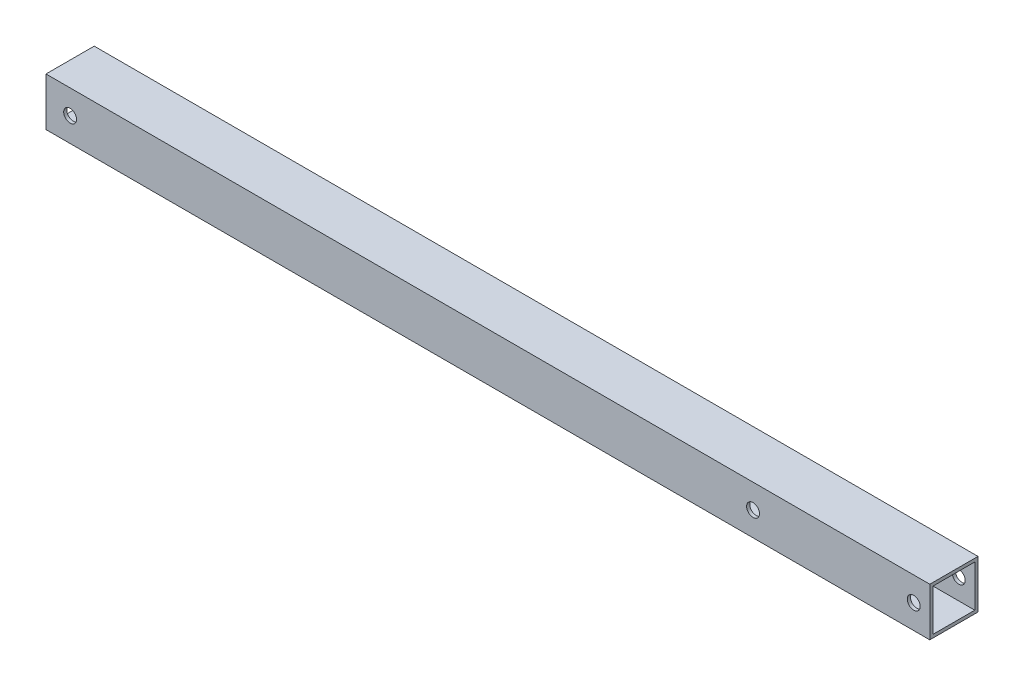
ISO-10303-21;
HEADER;
FILE_DESCRIPTION(('STEP AP214'),'2;1');
FILE_NAME('part.step','',(''),(''),'','','');
FILE_SCHEMA(('AUTOMOTIVE_DESIGN { 1 0 10303 214 1 1 1 1 }'));
ENDSEC;
DATA;
#1=APPLICATION_CONTEXT('core data for automotive mechanical design processes');
#2=APPLICATION_PROTOCOL_DEFINITION('international standard','automotive_design',2000,#1);
#3=PRODUCT_CONTEXT('',#1,'mechanical');
#4=PRODUCT('Part','Part','',(#3));
#5=PRODUCT_RELATED_PRODUCT_CATEGORY('part','',(#4));
#6=PRODUCT_DEFINITION_FORMATION('','',#4);
#7=PRODUCT_DEFINITION_CONTEXT('part definition',#1,'design');
#8=PRODUCT_DEFINITION('design','',#6,#7);
#9=PRODUCT_DEFINITION_SHAPE('','',#8);
#10=(LENGTH_UNIT() NAMED_UNIT(*) SI_UNIT(.MILLI.,.METRE.));
#11=(NAMED_UNIT(*) PLANE_ANGLE_UNIT() SI_UNIT($,.RADIAN.));
#12=(NAMED_UNIT(*) SI_UNIT($,.STERADIAN.) SOLID_ANGLE_UNIT());
#13=UNCERTAINTY_MEASURE_WITH_UNIT(LENGTH_MEASURE(1.E-05),#10,'distance_accuracy_value','');
#14=(GEOMETRIC_REPRESENTATION_CONTEXT(3) GLOBAL_UNCERTAINTY_ASSIGNED_CONTEXT((#13)) GLOBAL_UNIT_ASSIGNED_CONTEXT((#10,
#11,#12)) REPRESENTATION_CONTEXT('',''));
#15=CARTESIAN_POINT('',(0.,0.,0.));
#16=DIRECTION('',(0.,0.,1.));
#17=DIRECTION('',(1.,0.,0.));
#18=AXIS2_PLACEMENT_3D('',#15,#16,#17);
#19=CARTESIAN_POINT('',(550.,0.,0.));
#20=DIRECTION('',(-1.,0.,0.));
#21=DIRECTION('',(0.,0.,1.));
#22=AXIS2_PLACEMENT_3D('',#19,#20,#21);
#23=PLANE('',#22);
#24=DIRECTION('',(0.,-1.,0.));
#25=VECTOR('',#24,1.);
#26=CARTESIAN_POINT('',(550.,0.,0.));
#27=LINE('',#26,#25);
#28=CARTESIAN_POINT('',(550.,30.,0.));
#29=VERTEX_POINT('',#28);
#30=CARTESIAN_POINT('',(550.,0.,0.));
#31=VERTEX_POINT('',#30);
#32=EDGE_CURVE('E138',#29,#31,#27,.T.);
#33=ORIENTED_EDGE('',*,*,#32,.T.);
#34=DIRECTION('',(0.,0.,-1.));
#35=VECTOR('',#34,1.);
#36=CARTESIAN_POINT('',(550.,0.,0.));
#37=LINE('',#36,#35);
#38=CARTESIAN_POINT('',(550.,0.,-30.));
#39=VERTEX_POINT('',#38);
#40=EDGE_CURVE('E141',#31,#39,#37,.T.);
#41=ORIENTED_EDGE('',*,*,#40,.T.);
#42=DIRECTION('',(0.,1.,0.));
#43=VECTOR('',#42,1.);
#44=CARTESIAN_POINT('',(550.,0.,-30.));
#45=LINE('',#44,#43);
#46=CARTESIAN_POINT('',(550.,30.,-30.));
#47=VERTEX_POINT('',#46);
#48=EDGE_CURVE('E144',#39,#47,#45,.T.);
#49=ORIENTED_EDGE('',*,*,#48,.T.);
#50=DIRECTION('',(0.,0.,1.));
#51=VECTOR('',#50,1.);
#52=CARTESIAN_POINT('',(550.,30.,0.));
#53=LINE('',#52,#51);
#54=EDGE_CURVE('E146',#47,#29,#53,.T.);
#55=ORIENTED_EDGE('',*,*,#54,.T.);
#56=EDGE_LOOP('',(#33,#41,#49,#55));
#57=FACE_BOUND('',#56,.T.);
#58=DIRECTION('',(0.,-1.,0.));
#59=VECTOR('',#58,1.);
#60=CARTESIAN_POINT('',(550.,2.,-2.));
#61=LINE('',#60,#59);
#62=CARTESIAN_POINT('',(550.,28.,-2.));
#63=VERTEX_POINT('',#62);
#64=CARTESIAN_POINT('',(550.,2.,-2.));
#65=VERTEX_POINT('',#64);
#66=EDGE_CURVE('E100',#63,#65,#61,.T.);
#67=ORIENTED_EDGE('',*,*,#66,.F.);
#68=DIRECTION('',(0.,0.,1.));
#69=VECTOR('',#68,1.);
#70=CARTESIAN_POINT('',(550.,28.,-2.));
#71=LINE('',#70,#69);
#72=CARTESIAN_POINT('',(550.,28.,-28.));
#73=VERTEX_POINT('',#72);
#74=EDGE_CURVE('E122',#73,#63,#71,.T.);
#75=ORIENTED_EDGE('',*,*,#74,.F.);
#76=DIRECTION('',(0.,1.,0.));
#77=VECTOR('',#76,1.);
#78=CARTESIAN_POINT('',(550.,2.,-28.));
#79=LINE('',#78,#77);
#80=CARTESIAN_POINT('',(550.,2.,-28.));
#81=VERTEX_POINT('',#80);
#82=EDGE_CURVE('E120',#81,#73,#79,.T.);
#83=ORIENTED_EDGE('',*,*,#82,.F.);
#84=DIRECTION('',(0.,0.,-1.));
#85=VECTOR('',#84,1.);
#86=CARTESIAN_POINT('',(550.,2.,-2.));
#87=LINE('',#86,#85);
#88=EDGE_CURVE('E108',#65,#81,#87,.T.);
#89=ORIENTED_EDGE('',*,*,#88,.F.);
#90=EDGE_LOOP('',(#67,#75,#83,#89));
#91=FACE_BOUND('',#90,.T.);
#92=ADVANCED_FACE('F33',(#57,#91),#23,.F.);
#93=CARTESIAN_POINT('',(0.,0.,0.));
#94=DIRECTION('',(-1.,0.,0.));
#95=DIRECTION('',(0.,0.,1.));
#96=AXIS2_PLACEMENT_3D('',#93,#94,#95);
#97=PLANE('',#96);
#98=DIRECTION('',(0.,-1.,0.));
#99=VECTOR('',#98,1.);
#100=CARTESIAN_POINT('',(0.,0.,0.));
#101=LINE('',#100,#99);
#102=CARTESIAN_POINT('',(0.,30.,0.));
#103=VERTEX_POINT('',#102);
#104=CARTESIAN_POINT('',(0.,0.,0.));
#105=VERTEX_POINT('',#104);
#106=EDGE_CURVE('E116',#103,#105,#101,.T.);
#107=ORIENTED_EDGE('',*,*,#106,.F.);
#108=DIRECTION('',(0.,0.,1.));
#109=VECTOR('',#108,1.);
#110=CARTESIAN_POINT('',(0.,30.,0.));
#111=LINE('',#110,#109);
#112=CARTESIAN_POINT('',(0.,30.,-30.));
#113=VERTEX_POINT('',#112);
#114=EDGE_CURVE('E142',#113,#103,#111,.T.);
#115=ORIENTED_EDGE('',*,*,#114,.F.);
#116=DIRECTION('',(0.,1.,0.));
#117=VECTOR('',#116,1.);
#118=CARTESIAN_POINT('',(0.,0.,-30.));
#119=LINE('',#118,#117);
#120=CARTESIAN_POINT('',(0.,0.,-30.));
#121=VERTEX_POINT('',#120);
#122=EDGE_CURVE('E153',#121,#113,#119,.T.);
#123=ORIENTED_EDGE('',*,*,#122,.F.);
#124=DIRECTION('',(0.,0.,-1.));
#125=VECTOR('',#124,1.);
#126=CARTESIAN_POINT('',(0.,0.,0.));
#127=LINE('',#126,#125);
#128=EDGE_CURVE('E151',#105,#121,#127,.T.);
#129=ORIENTED_EDGE('',*,*,#128,.F.);
#130=EDGE_LOOP('',(#107,#115,#123,#129));
#131=FACE_BOUND('',#130,.T.);
#132=DIRECTION('',(0.,0.,1.));
#133=VECTOR('',#132,1.);
#134=CARTESIAN_POINT('',(0.,28.,-2.));
#135=LINE('',#134,#133);
#136=CARTESIAN_POINT('',(0.,28.,-28.));
#137=VERTEX_POINT('',#136);
#138=CARTESIAN_POINT('',(0.,28.,-2.));
#139=VERTEX_POINT('',#138);
#140=EDGE_CURVE('E109',#137,#139,#135,.T.);
#141=ORIENTED_EDGE('',*,*,#140,.T.);
#142=DIRECTION('',(0.,-1.,0.));
#143=VECTOR('',#142,1.);
#144=CARTESIAN_POINT('',(0.,2.,-2.));
#145=LINE('',#144,#143);
#146=CARTESIAN_POINT('',(0.,2.,-2.));
#147=VERTEX_POINT('',#146);
#148=EDGE_CURVE('E58',#139,#147,#145,.T.);
#149=ORIENTED_EDGE('',*,*,#148,.T.);
#150=DIRECTION('',(0.,0.,-1.));
#151=VECTOR('',#150,1.);
#152=CARTESIAN_POINT('',(0.,2.,-2.));
#153=LINE('',#152,#151);
#154=CARTESIAN_POINT('',(0.,2.,-28.));
#155=VERTEX_POINT('',#154);
#156=EDGE_CURVE('E115',#147,#155,#153,.T.);
#157=ORIENTED_EDGE('',*,*,#156,.T.);
#158=DIRECTION('',(0.,1.,0.));
#159=VECTOR('',#158,1.);
#160=CARTESIAN_POINT('',(0.,2.,-28.));
#161=LINE('',#160,#159);
#162=EDGE_CURVE('E130',#155,#137,#161,.T.);
#163=ORIENTED_EDGE('',*,*,#162,.T.);
#164=EDGE_LOOP('',(#141,#149,#157,#163));
#165=FACE_BOUND('',#164,.T.);
#166=ADVANCED_FACE('F209',(#131,#165),#97,.T.);
#167=CARTESIAN_POINT('',(550.,0.,0.));
#168=DIRECTION('',(0.,0.,-1.));
#169=DIRECTION('',(-1.,0.,0.));
#170=AXIS2_PLACEMENT_3D('',#167,#168,#169);
#171=PLANE('',#170);
#172=CARTESIAN_POINT('',(15.,15.,0.));
#173=DIRECTION('',(0.,0.,-1.));
#174=DIRECTION('',(-1.,0.,0.));
#175=AXIS2_PLACEMENT_3D('',#172,#173,#174);
#176=CIRCLE('',#175,4.);
#177=CARTESIAN_POINT('',(19.,15.,0.));
#178=VERTEX_POINT('',#177);
#179=EDGE_CURVE('E128',#178,#178,#176,.T.);
#180=ORIENTED_EDGE('',*,*,#179,.T.);
#181=EDGE_LOOP('',(#180));
#182=FACE_BOUND('',#181,.T.);
#183=CARTESIAN_POINT('',(540.,15.,0.));
#184=DIRECTION('',(0.,0.,-1.));
#185=DIRECTION('',(-1.,0.,0.));
#186=AXIS2_PLACEMENT_3D('',#183,#184,#185);
#187=CIRCLE('',#186,3.99999999999999);
#188=CARTESIAN_POINT('',(544.,15.,0.));
#189=VERTEX_POINT('',#188);
#190=EDGE_CURVE('E174',#189,#189,#187,.T.);
#191=ORIENTED_EDGE('',*,*,#190,.T.);
#192=EDGE_LOOP('',(#191));
#193=FACE_BOUND('',#192,.T.);
#194=CARTESIAN_POINT('',(440.,15.,0.));
#195=DIRECTION('',(0.,0.,-1.));
#196=DIRECTION('',(-1.,0.,0.));
#197=AXIS2_PLACEMENT_3D('',#194,#195,#196);
#198=CIRCLE('',#197,3.99999999999982);
#199=CARTESIAN_POINT('',(444.,15.,0.));
#200=VERTEX_POINT('',#199);
#201=EDGE_CURVE('E170',#200,#200,#198,.T.);
#202=ORIENTED_EDGE('',*,*,#201,.T.);
#203=EDGE_LOOP('',(#202));
#204=FACE_BOUND('',#203,.T.);
#205=ORIENTED_EDGE('',*,*,#106,.T.);
#206=DIRECTION('',(-1.,0.,0.));
#207=VECTOR('',#206,1.);
#208=CARTESIAN_POINT('',(550.,0.,0.));
#209=LINE('',#208,#207);
#210=EDGE_CURVE('E11',#31,#105,#209,.T.);
#211=ORIENTED_EDGE('',*,*,#210,.F.);
#212=ORIENTED_EDGE('',*,*,#32,.F.);
#213=DIRECTION('',(-1.,0.,0.));
#214=VECTOR('',#213,1.);
#215=CARTESIAN_POINT('',(550.,30.,0.));
#216=LINE('',#215,#214);
#217=EDGE_CURVE('E148',#29,#103,#216,.T.);
#218=ORIENTED_EDGE('',*,*,#217,.T.);
#219=EDGE_LOOP('',(#205,#211,#212,#218));
#220=FACE_BOUND('',#219,.T.);
#221=ADVANCED_FACE('F35',(#182,#193,#204,#220),#171,.F.);
#222=CARTESIAN_POINT('',(550.,0.,0.));
#223=DIRECTION('',(0.,1.,0.));
#224=DIRECTION('',(0.,0.,1.));
#225=AXIS2_PLACEMENT_3D('',#222,#223,#224);
#226=PLANE('',#225);
#227=ORIENTED_EDGE('',*,*,#128,.T.);
#228=DIRECTION('',(-1.,0.,0.));
#229=VECTOR('',#228,1.);
#230=CARTESIAN_POINT('',(550.,0.,-30.));
#231=LINE('',#230,#229);
#232=EDGE_CURVE('E42',#39,#121,#231,.T.);
#233=ORIENTED_EDGE('',*,*,#232,.F.);
#234=ORIENTED_EDGE('',*,*,#40,.F.);
#235=ORIENTED_EDGE('',*,*,#210,.T.);
#236=EDGE_LOOP('',(#227,#233,#234,#235));
#237=FACE_BOUND('',#236,.T.);
#238=ADVANCED_FACE('F226',(#237),#226,.F.);
#239=CARTESIAN_POINT('',(550.,0.,-30.));
#240=DIRECTION('',(0.,0.,1.));
#241=DIRECTION('',(1.,0.,0.));
#242=AXIS2_PLACEMENT_3D('',#239,#240,#241);
#243=PLANE('',#242);
#244=CARTESIAN_POINT('',(15.,15.,-30.));
#245=DIRECTION('',(0.,0.,1.));
#246=DIRECTION('',(1.,0.,0.));
#247=AXIS2_PLACEMENT_3D('',#244,#245,#246);
#248=CIRCLE('',#247,4.);
#249=CARTESIAN_POINT('',(19.,15.,-30.));
#250=VERTEX_POINT('',#249);
#251=EDGE_CURVE('E166',#250,#250,#248,.T.);
#252=ORIENTED_EDGE('',*,*,#251,.T.);
#253=EDGE_LOOP('',(#252));
#254=FACE_BOUND('',#253,.T.);
#255=CARTESIAN_POINT('',(540.,15.,-30.));
#256=DIRECTION('',(0.,0.,1.));
#257=DIRECTION('',(1.,0.,0.));
#258=AXIS2_PLACEMENT_3D('',#255,#256,#257);
#259=CIRCLE('',#258,3.99999999999999);
#260=CARTESIAN_POINT('',(544.,15.,-30.));
#261=VERTEX_POINT('',#260);
#262=EDGE_CURVE('E363',#261,#261,#259,.T.);
#263=ORIENTED_EDGE('',*,*,#262,.T.);
#264=EDGE_LOOP('',(#263));
#265=FACE_BOUND('',#264,.T.);
#266=CARTESIAN_POINT('',(440.,15.,-30.));
#267=DIRECTION('',(0.,0.,1.));
#268=DIRECTION('',(1.,0.,0.));
#269=AXIS2_PLACEMENT_3D('',#266,#267,#268);
#270=CIRCLE('',#269,3.99999999999982);
#271=CARTESIAN_POINT('',(444.,15.,-30.));
#272=VERTEX_POINT('',#271);
#273=EDGE_CURVE('E365',#272,#272,#270,.T.);
#274=ORIENTED_EDGE('',*,*,#273,.T.);
#275=EDGE_LOOP('',(#274));
#276=FACE_BOUND('',#275,.T.);
#277=ORIENTED_EDGE('',*,*,#122,.T.);
#278=DIRECTION('',(-1.,0.,0.));
#279=VECTOR('',#278,1.);
#280=CARTESIAN_POINT('',(550.,30.,-30.));
#281=LINE('',#280,#279);
#282=EDGE_CURVE('E158',#47,#113,#281,.T.);
#283=ORIENTED_EDGE('',*,*,#282,.F.);
#284=ORIENTED_EDGE('',*,*,#48,.F.);
#285=ORIENTED_EDGE('',*,*,#232,.T.);
#286=EDGE_LOOP('',(#277,#283,#284,#285));
#287=FACE_BOUND('',#286,.T.);
#288=ADVANCED_FACE('F223',(#254,#265,#276,#287),#243,.F.);
#289=CARTESIAN_POINT('',(550.,30.,0.));
#290=DIRECTION('',(0.,-1.,0.));
#291=DIRECTION('',(0.,0.,-1.));
#292=AXIS2_PLACEMENT_3D('',#289,#290,#291);
#293=PLANE('',#292);
#294=ORIENTED_EDGE('',*,*,#114,.T.);
#295=ORIENTED_EDGE('',*,*,#217,.F.);
#296=ORIENTED_EDGE('',*,*,#54,.F.);
#297=ORIENTED_EDGE('',*,*,#282,.T.);
#298=EDGE_LOOP('',(#294,#295,#296,#297));
#299=FACE_BOUND('',#298,.T.);
#300=ADVANCED_FACE('F220',(#299),#293,.F.);
#301=CARTESIAN_POINT('',(550.,2.,-2.));
#302=DIRECTION('',(0.,0.,-1.));
#303=DIRECTION('',(-1.,0.,0.));
#304=AXIS2_PLACEMENT_3D('',#301,#302,#303);
#305=PLANE('',#304);
#306=CARTESIAN_POINT('',(15.,15.,-2.));
#307=DIRECTION('',(0.,0.,-1.));
#308=DIRECTION('',(-1.,0.,0.));
#309=AXIS2_PLACEMENT_3D('',#306,#307,#308);
#310=CIRCLE('',#309,4.);
#311=CARTESIAN_POINT('',(19.,15.,-1.99999999999999));
#312=VERTEX_POINT('',#311);
#313=EDGE_CURVE('E186',#312,#312,#310,.T.);
#314=ORIENTED_EDGE('',*,*,#313,.F.);
#315=EDGE_LOOP('',(#314));
#316=FACE_BOUND('',#315,.T.);
#317=CARTESIAN_POINT('',(540.,15.,-2.));
#318=DIRECTION('',(0.,0.,-1.));
#319=DIRECTION('',(-1.,0.,0.));
#320=AXIS2_PLACEMENT_3D('',#317,#318,#319);
#321=CIRCLE('',#320,3.99999999999999);
#322=CARTESIAN_POINT('',(544.,15.,-1.99999999999999));
#323=VERTEX_POINT('',#322);
#324=EDGE_CURVE('E169',#323,#323,#321,.T.);
#325=ORIENTED_EDGE('',*,*,#324,.F.);
#326=EDGE_LOOP('',(#325));
#327=FACE_BOUND('',#326,.T.);
#328=CARTESIAN_POINT('',(440.,15.,-2.));
#329=DIRECTION('',(0.,0.,-1.));
#330=DIRECTION('',(-1.,0.,0.));
#331=AXIS2_PLACEMENT_3D('',#328,#329,#330);
#332=CIRCLE('',#331,3.99999999999982);
#333=CARTESIAN_POINT('',(444.,15.,-1.99999999999999));
#334=VERTEX_POINT('',#333);
#335=EDGE_CURVE('E165',#334,#334,#332,.T.);
#336=ORIENTED_EDGE('',*,*,#335,.F.);
#337=EDGE_LOOP('',(#336));
#338=FACE_BOUND('',#337,.T.);
#339=ORIENTED_EDGE('',*,*,#148,.F.);
#340=DIRECTION('',(-1.,0.,0.));
#341=VECTOR('',#340,1.);
#342=CARTESIAN_POINT('',(550.,28.,-2.));
#343=LINE('',#342,#341);
#344=EDGE_CURVE('E104',#63,#139,#343,.T.);
#345=ORIENTED_EDGE('',*,*,#344,.F.);
#346=ORIENTED_EDGE('',*,*,#66,.T.);
#347=DIRECTION('',(-1.,0.,0.));
#348=VECTOR('',#347,1.);
#349=CARTESIAN_POINT('',(550.,2.,-2.));
#350=LINE('',#349,#348);
#351=EDGE_CURVE('E103',#65,#147,#350,.T.);
#352=ORIENTED_EDGE('',*,*,#351,.T.);
#353=EDGE_LOOP('',(#339,#345,#346,#352));
#354=FACE_BOUND('',#353,.T.);
#355=ADVANCED_FACE('F102',(#316,#327,#338,#354),#305,.T.);
#356=CARTESIAN_POINT('',(550.,2.,-2.));
#357=DIRECTION('',(0.,1.,0.));
#358=DIRECTION('',(0.,0.,1.));
#359=AXIS2_PLACEMENT_3D('',#356,#357,#358);
#360=PLANE('',#359);
#361=ORIENTED_EDGE('',*,*,#156,.F.);
#362=ORIENTED_EDGE('',*,*,#351,.F.);
#363=ORIENTED_EDGE('',*,*,#88,.T.);
#364=DIRECTION('',(-1.,0.,0.));
#365=VECTOR('',#364,1.);
#366=CARTESIAN_POINT('',(550.,2.,-28.));
#367=LINE('',#366,#365);
#368=EDGE_CURVE('E117',#81,#155,#367,.T.);
#369=ORIENTED_EDGE('',*,*,#368,.T.);
#370=EDGE_LOOP('',(#361,#362,#363,#369));
#371=FACE_BOUND('',#370,.T.);
#372=ADVANCED_FACE('F112',(#371),#360,.T.);
#373=CARTESIAN_POINT('',(550.,2.,-28.));
#374=DIRECTION('',(0.,0.,1.));
#375=DIRECTION('',(1.,0.,0.));
#376=AXIS2_PLACEMENT_3D('',#373,#374,#375);
#377=PLANE('',#376);
#378=CARTESIAN_POINT('',(15.,15.,-28.));
#379=DIRECTION('',(0.,0.,1.));
#380=DIRECTION('',(1.,0.,0.));
#381=AXIS2_PLACEMENT_3D('',#378,#379,#380);
#382=CIRCLE('',#381,4.);
#383=CARTESIAN_POINT('',(19.,15.,-28.));
#384=VERTEX_POINT('',#383);
#385=EDGE_CURVE('E37',#384,#384,#382,.T.);
#386=ORIENTED_EDGE('',*,*,#385,.F.);
#387=EDGE_LOOP('',(#386));
#388=FACE_BOUND('',#387,.T.);
#389=CARTESIAN_POINT('',(540.,15.,-28.));
#390=DIRECTION('',(0.,0.,1.));
#391=DIRECTION('',(1.,0.,0.));
#392=AXIS2_PLACEMENT_3D('',#389,#390,#391);
#393=CIRCLE('',#392,3.99999999999999);
#394=CARTESIAN_POINT('',(544.,15.,-28.));
#395=VERTEX_POINT('',#394);
#396=EDGE_CURVE('E167',#395,#395,#393,.T.);
#397=ORIENTED_EDGE('',*,*,#396,.F.);
#398=EDGE_LOOP('',(#397));
#399=FACE_BOUND('',#398,.T.);
#400=CARTESIAN_POINT('',(440.,15.,-28.));
#401=DIRECTION('',(0.,0.,1.));
#402=DIRECTION('',(1.,0.,0.));
#403=AXIS2_PLACEMENT_3D('',#400,#401,#402);
#404=CIRCLE('',#403,3.99999999999982);
#405=CARTESIAN_POINT('',(444.,15.,-28.));
#406=VERTEX_POINT('',#405);
#407=EDGE_CURVE('E163',#406,#406,#404,.T.);
#408=ORIENTED_EDGE('',*,*,#407,.F.);
#409=EDGE_LOOP('',(#408));
#410=FACE_BOUND('',#409,.T.);
#411=ORIENTED_EDGE('',*,*,#162,.F.);
#412=ORIENTED_EDGE('',*,*,#368,.F.);
#413=ORIENTED_EDGE('',*,*,#82,.T.);
#414=DIRECTION('',(-1.,0.,0.));
#415=VECTOR('',#414,1.);
#416=CARTESIAN_POINT('',(550.,28.,-28.));
#417=LINE('',#416,#415);
#418=EDGE_CURVE('E50',#73,#137,#417,.T.);
#419=ORIENTED_EDGE('',*,*,#418,.T.);
#420=EDGE_LOOP('',(#411,#412,#413,#419));
#421=FACE_BOUND('',#420,.T.);
#422=ADVANCED_FACE('F250',(#388,#399,#410,#421),#377,.T.);
#423=CARTESIAN_POINT('',(550.,28.,-2.));
#424=DIRECTION('',(0.,-1.,0.));
#425=DIRECTION('',(0.,0.,-1.));
#426=AXIS2_PLACEMENT_3D('',#423,#424,#425);
#427=PLANE('',#426);
#428=ORIENTED_EDGE('',*,*,#140,.F.);
#429=ORIENTED_EDGE('',*,*,#418,.F.);
#430=ORIENTED_EDGE('',*,*,#74,.T.);
#431=ORIENTED_EDGE('',*,*,#344,.T.);
#432=EDGE_LOOP('',(#428,#429,#430,#431));
#433=FACE_BOUND('',#432,.T.);
#434=ADVANCED_FACE('F247',(#433),#427,.T.);
#435=CARTESIAN_POINT('',(440.,15.,-30.));
#436=DIRECTION('',(0.,0.,1.));
#437=DIRECTION('',(1.,0.,0.));
#438=AXIS2_PLACEMENT_3D('',#435,#436,#437);
#439=CYLINDRICAL_SURFACE('',#438,3.99999999999982);
#440=CARTESIAN_POINT('',(444.,15.,-28.));
#441=CARTESIAN_POINT('',(444.,15.,-28.0208333333333));
#442=CARTESIAN_POINT('',(444.,15.,-28.0416666666667));
#443=CARTESIAN_POINT('',(444.,15.,-28.0833333333333));
#444=CARTESIAN_POINT('',(444.,15.,-28.1041666666667));
#445=CARTESIAN_POINT('',(444.,15.,-28.1458333333333));
#446=CARTESIAN_POINT('',(444.,15.,-28.1666666666667));
#447=CARTESIAN_POINT('',(444.,15.,-28.2083333333333));
#448=CARTESIAN_POINT('',(444.,15.,-28.2291666666667));
#449=CARTESIAN_POINT('',(444.,15.,-28.2708333333333));
#450=CARTESIAN_POINT('',(444.,15.,-28.2916666666667));
#451=CARTESIAN_POINT('',(444.,15.,-28.3333333333333));
#452=CARTESIAN_POINT('',(444.,15.,-28.3541666666667));
#453=CARTESIAN_POINT('',(444.,15.,-28.3958333333333));
#454=CARTESIAN_POINT('',(444.,15.,-28.4166666666667));
#455=CARTESIAN_POINT('',(444.,15.,-28.4583333333333));
#456=CARTESIAN_POINT('',(444.,15.,-28.4791666666667));
#457=CARTESIAN_POINT('',(444.,15.,-28.5208333333333));
#458=CARTESIAN_POINT('',(444.,15.,-28.5416666666667));
#459=CARTESIAN_POINT('',(444.,15.,-28.5833333333333));
#460=CARTESIAN_POINT('',(444.,15.,-28.6041666666667));
#461=CARTESIAN_POINT('',(444.,15.,-28.6458333333333));
#462=CARTESIAN_POINT('',(444.,15.,-28.6666666666667));
#463=CARTESIAN_POINT('',(444.,15.,-28.7083333333333));
#464=CARTESIAN_POINT('',(444.,15.,-28.7291666666667));
#465=CARTESIAN_POINT('',(444.,15.,-28.7708333333333));
#466=CARTESIAN_POINT('',(444.,15.,-28.7916666666667));
#467=CARTESIAN_POINT('',(444.,15.,-28.8333333333333));
#468=CARTESIAN_POINT('',(444.,15.,-28.8541666666667));
#469=CARTESIAN_POINT('',(444.,15.,-28.8958333333333));
#470=CARTESIAN_POINT('',(444.,15.,-28.9166666666667));
#471=CARTESIAN_POINT('',(444.,15.,-28.9583333333333));
#472=CARTESIAN_POINT('',(444.,15.,-28.9791666666667));
#473=CARTESIAN_POINT('',(444.,15.,-29.0208333333333));
#474=CARTESIAN_POINT('',(444.,15.,-29.0416666666667));
#475=CARTESIAN_POINT('',(444.,15.,-29.0833333333333));
#476=CARTESIAN_POINT('',(444.,15.,-29.1041666666667));
#477=CARTESIAN_POINT('',(444.,15.,-29.1458333333333));
#478=CARTESIAN_POINT('',(444.,15.,-29.1666666666667));
#479=CARTESIAN_POINT('',(444.,15.,-29.2083333333333));
#480=CARTESIAN_POINT('',(444.,15.,-29.2291666666667));
#481=CARTESIAN_POINT('',(444.,15.,-29.2708333333333));
#482=CARTESIAN_POINT('',(444.,15.,-29.2916666666667));
#483=CARTESIAN_POINT('',(444.,15.,-29.3333333333333));
#484=CARTESIAN_POINT('',(444.,15.,-29.3541666666667));
#485=CARTESIAN_POINT('',(444.,15.,-29.3958333333333));
#486=CARTESIAN_POINT('',(444.,15.,-29.4166666666667));
#487=CARTESIAN_POINT('',(444.,15.,-29.4583333333333));
#488=CARTESIAN_POINT('',(444.,15.,-29.4791666666667));
#489=CARTESIAN_POINT('',(444.,15.,-29.5208333333333));
#490=CARTESIAN_POINT('',(444.,15.,-29.5416666666667));
#491=CARTESIAN_POINT('',(444.,15.,-29.5833333333333));
#492=CARTESIAN_POINT('',(444.,15.,-29.6041666666667));
#493=CARTESIAN_POINT('',(444.,15.,-29.6458333333333));
#494=CARTESIAN_POINT('',(444.,15.,-29.6666666666667));
#495=CARTESIAN_POINT('',(444.,15.,-29.7083333333333));
#496=CARTESIAN_POINT('',(444.,15.,-29.7291666666667));
#497=CARTESIAN_POINT('',(444.,15.,-29.7708333333333));
#498=CARTESIAN_POINT('',(444.,15.,-29.7916666666667));
#499=CARTESIAN_POINT('',(444.,15.,-29.8333333333333));
#500=CARTESIAN_POINT('',(444.,15.,-29.8541666666667));
#501=CARTESIAN_POINT('',(444.,15.,-29.8958333333333));
#502=CARTESIAN_POINT('',(444.,15.,-29.9166666666667));
#503=CARTESIAN_POINT('',(444.,15.,-29.9583333333333));
#504=CARTESIAN_POINT('',(444.,15.,-29.9791666666667));
#505=CARTESIAN_POINT('',(444.,15.,-30.));
#506=B_SPLINE_CURVE_WITH_KNOTS('',3,(#440,#441,#442,#443,#444,#445,#446,#447,#448,#449,#450,
#451,#452,#453,#454,#455,#456,#457,#458,#459,#460,#461,#462,#463,#464,#465,#466,#467,#468,#469,
#470,#471,#472,#473,#474,#475,#476,#477,#478,#479,#480,#481,#482,#483,#484,#485,#486,#487,#488,
#489,#490,#491,#492,#493,#494,#495,#496,#497,#498,#499,#500,#501,#502,#503,#504,#505),
.UNSPECIFIED.,.F.,.F.,(4,2,2,2,2,2,2,2,2,2,2,2,2,2,2,2,2,2,2,2,2,2,2,2,2,2,2,2,2,2,2,2,4),(0.,
0.0625000000000001,0.124999999999997,0.187499999999997,0.249999999999997,0.312499999999997,
0.374999999999997,0.437499999999997,0.499999999999997,0.562499999999997,0.624999999999997,
0.687499999999997,0.749999999999997,0.812499999999997,0.874999999999997,0.937499999999997,
0.999999999999997,1.0625,1.125,1.1875,1.25,1.3125,1.375,1.4375,1.5,1.5625,1.625,1.6875,1.75,
1.8125,1.875,1.9375,1.99999999999999),.UNSPECIFIED.);
#507=EDGE_CURVE('BSEAM249',#406,#272,#506,.T.);
#508=ORIENTED_EDGE('',*,*,#407,.T.);
#509=ORIENTED_EDGE('',*,*,#273,.F.);
#510=ORIENTED_EDGE('',*,*,#507,.T.);
#511=ORIENTED_EDGE('',*,*,#507,.F.);
#512=EDGE_LOOP('',(#508,#510,#509,#511));
#513=FACE_BOUND('',#512,.T.);
#514=ADVANCED_FACE('F249',(#513),#439,.F.);
#515=CARTESIAN_POINT('',(540.,15.,-30.));
#516=DIRECTION('',(0.,0.,1.));
#517=DIRECTION('',(1.,0.,0.));
#518=AXIS2_PLACEMENT_3D('',#515,#516,#517);
#519=CYLINDRICAL_SURFACE('',#518,3.99999999999999);
#520=CARTESIAN_POINT('',(544.,15.,-28.));
#521=CARTESIAN_POINT('',(544.,15.,-28.0208333333333));
#522=CARTESIAN_POINT('',(544.,15.,-28.0416666666667));
#523=CARTESIAN_POINT('',(544.,15.,-28.0833333333333));
#524=CARTESIAN_POINT('',(544.,15.,-28.1041666666667));
#525=CARTESIAN_POINT('',(544.,15.,-28.1458333333333));
#526=CARTESIAN_POINT('',(544.,15.,-28.1666666666667));
#527=CARTESIAN_POINT('',(544.,15.,-28.2083333333333));
#528=CARTESIAN_POINT('',(544.,15.,-28.2291666666667));
#529=CARTESIAN_POINT('',(544.,15.,-28.2708333333333));
#530=CARTESIAN_POINT('',(544.,15.,-28.2916666666667));
#531=CARTESIAN_POINT('',(544.,15.,-28.3333333333333));
#532=CARTESIAN_POINT('',(544.,15.,-28.3541666666667));
#533=CARTESIAN_POINT('',(544.,15.,-28.3958333333333));
#534=CARTESIAN_POINT('',(544.,15.,-28.4166666666667));
#535=CARTESIAN_POINT('',(544.,15.,-28.4583333333333));
#536=CARTESIAN_POINT('',(544.,15.,-28.4791666666667));
#537=CARTESIAN_POINT('',(544.,15.,-28.5208333333333));
#538=CARTESIAN_POINT('',(544.,15.,-28.5416666666667));
#539=CARTESIAN_POINT('',(544.,15.,-28.5833333333333));
#540=CARTESIAN_POINT('',(544.,15.,-28.6041666666667));
#541=CARTESIAN_POINT('',(544.,15.,-28.6458333333333));
#542=CARTESIAN_POINT('',(544.,15.,-28.6666666666667));
#543=CARTESIAN_POINT('',(544.,15.,-28.7083333333333));
#544=CARTESIAN_POINT('',(544.,15.,-28.7291666666667));
#545=CARTESIAN_POINT('',(544.,15.,-28.7708333333333));
#546=CARTESIAN_POINT('',(544.,15.,-28.7916666666667));
#547=CARTESIAN_POINT('',(544.,15.,-28.8333333333333));
#548=CARTESIAN_POINT('',(544.,15.,-28.8541666666667));
#549=CARTESIAN_POINT('',(544.,15.,-28.8958333333333));
#550=CARTESIAN_POINT('',(544.,15.,-28.9166666666667));
#551=CARTESIAN_POINT('',(544.,15.,-28.9583333333333));
#552=CARTESIAN_POINT('',(544.,15.,-28.9791666666667));
#553=CARTESIAN_POINT('',(544.,15.,-29.0208333333333));
#554=CARTESIAN_POINT('',(544.,15.,-29.0416666666667));
#555=CARTESIAN_POINT('',(544.,15.,-29.0833333333333));
#556=CARTESIAN_POINT('',(544.,15.,-29.1041666666667));
#557=CARTESIAN_POINT('',(544.,15.,-29.1458333333333));
#558=CARTESIAN_POINT('',(544.,15.,-29.1666666666667));
#559=CARTESIAN_POINT('',(544.,15.,-29.2083333333333));
#560=CARTESIAN_POINT('',(544.,15.,-29.2291666666667));
#561=CARTESIAN_POINT('',(544.,15.,-29.2708333333333));
#562=CARTESIAN_POINT('',(544.,15.,-29.2916666666667));
#563=CARTESIAN_POINT('',(544.,15.,-29.3333333333333));
#564=CARTESIAN_POINT('',(544.,15.,-29.3541666666667));
#565=CARTESIAN_POINT('',(544.,15.,-29.3958333333333));
#566=CARTESIAN_POINT('',(544.,15.,-29.4166666666667));
#567=CARTESIAN_POINT('',(544.,15.,-29.4583333333333));
#568=CARTESIAN_POINT('',(544.,15.,-29.4791666666667));
#569=CARTESIAN_POINT('',(544.,15.,-29.5208333333333));
#570=CARTESIAN_POINT('',(544.,15.,-29.5416666666667));
#571=CARTESIAN_POINT('',(544.,15.,-29.5833333333333));
#572=CARTESIAN_POINT('',(544.,15.,-29.6041666666667));
#573=CARTESIAN_POINT('',(544.,15.,-29.6458333333333));
#574=CARTESIAN_POINT('',(544.,15.,-29.6666666666667));
#575=CARTESIAN_POINT('',(544.,15.,-29.7083333333333));
#576=CARTESIAN_POINT('',(544.,15.,-29.7291666666667));
#577=CARTESIAN_POINT('',(544.,15.,-29.7708333333333));
#578=CARTESIAN_POINT('',(544.,15.,-29.7916666666667));
#579=CARTESIAN_POINT('',(544.,15.,-29.8333333333333));
#580=CARTESIAN_POINT('',(544.,15.,-29.8541666666667));
#581=CARTESIAN_POINT('',(544.,15.,-29.8958333333333));
#582=CARTESIAN_POINT('',(544.,15.,-29.9166666666667));
#583=CARTESIAN_POINT('',(544.,15.,-29.9583333333333));
#584=CARTESIAN_POINT('',(544.,15.,-29.9791666666667));
#585=CARTESIAN_POINT('',(544.,15.,-30.));
#586=B_SPLINE_CURVE_WITH_KNOTS('',3,(#520,#521,#522,#523,#524,#525,#526,#527,#528,#529,#530,
#531,#532,#533,#534,#535,#536,#537,#538,#539,#540,#541,#542,#543,#544,#545,#546,#547,#548,#549,
#550,#551,#552,#553,#554,#555,#556,#557,#558,#559,#560,#561,#562,#563,#564,#565,#566,#567,#568,
#569,#570,#571,#572,#573,#574,#575,#576,#577,#578,#579,#580,#581,#582,#583,#584,#585),
.UNSPECIFIED.,.F.,.F.,(4,2,2,2,2,2,2,2,2,2,2,2,2,2,2,2,2,2,2,2,2,2,2,2,2,2,2,2,2,2,2,2,4),(0.,
0.0625000000000001,0.124999999999997,0.187499999999997,0.249999999999997,0.312499999999997,
0.374999999999997,0.437499999999997,0.499999999999997,0.562499999999997,0.624999999999997,
0.687499999999997,0.749999999999997,0.812499999999997,0.874999999999997,0.937499999999997,
0.999999999999997,1.0625,1.125,1.1875,1.25,1.3125,1.375,1.4375,1.5,1.5625,1.625,1.6875,1.75,
1.8125,1.875,1.9375,1.99999999999999),.UNSPECIFIED.);
#587=EDGE_CURVE('BSEAM205',#395,#261,#586,.T.);
#588=ORIENTED_EDGE('',*,*,#396,.T.);
#589=ORIENTED_EDGE('',*,*,#262,.F.);
#590=ORIENTED_EDGE('',*,*,#587,.T.);
#591=ORIENTED_EDGE('',*,*,#587,.F.);
#592=EDGE_LOOP('',(#588,#590,#589,#591));
#593=FACE_BOUND('',#592,.T.);
#594=ADVANCED_FACE('F205',(#593),#519,.F.);
#595=CARTESIAN_POINT('',(15.,15.,-30.));
#596=DIRECTION('',(0.,0.,1.));
#597=DIRECTION('',(1.,0.,0.));
#598=AXIS2_PLACEMENT_3D('',#595,#596,#597);
#599=CYLINDRICAL_SURFACE('',#598,4.);
#600=CARTESIAN_POINT('',(19.,15.,-28.));
#601=CARTESIAN_POINT('',(19.,15.,-28.0208333333333));
#602=CARTESIAN_POINT('',(19.,15.,-28.0416666666667));
#603=CARTESIAN_POINT('',(19.,15.,-28.0833333333333));
#604=CARTESIAN_POINT('',(19.,15.,-28.1041666666667));
#605=CARTESIAN_POINT('',(19.,15.,-28.1458333333333));
#606=CARTESIAN_POINT('',(19.,15.,-28.1666666666667));
#607=CARTESIAN_POINT('',(19.,15.,-28.2083333333333));
#608=CARTESIAN_POINT('',(19.,15.,-28.2291666666667));
#609=CARTESIAN_POINT('',(19.,15.,-28.2708333333333));
#610=CARTESIAN_POINT('',(19.,15.,-28.2916666666667));
#611=CARTESIAN_POINT('',(19.,15.,-28.3333333333333));
#612=CARTESIAN_POINT('',(19.,15.,-28.3541666666667));
#613=CARTESIAN_POINT('',(19.,15.,-28.3958333333333));
#614=CARTESIAN_POINT('',(19.,15.,-28.4166666666667));
#615=CARTESIAN_POINT('',(19.,15.,-28.4583333333333));
#616=CARTESIAN_POINT('',(19.,15.,-28.4791666666667));
#617=CARTESIAN_POINT('',(19.,15.,-28.5208333333333));
#618=CARTESIAN_POINT('',(19.,15.,-28.5416666666667));
#619=CARTESIAN_POINT('',(19.,15.,-28.5833333333333));
#620=CARTESIAN_POINT('',(19.,15.,-28.6041666666667));
#621=CARTESIAN_POINT('',(19.,15.,-28.6458333333333));
#622=CARTESIAN_POINT('',(19.,15.,-28.6666666666667));
#623=CARTESIAN_POINT('',(19.,15.,-28.7083333333333));
#624=CARTESIAN_POINT('',(19.,15.,-28.7291666666667));
#625=CARTESIAN_POINT('',(19.,15.,-28.7708333333333));
#626=CARTESIAN_POINT('',(19.,15.,-28.7916666666667));
#627=CARTESIAN_POINT('',(19.,15.,-28.8333333333333));
#628=CARTESIAN_POINT('',(19.,15.,-28.8541666666667));
#629=CARTESIAN_POINT('',(19.,15.,-28.8958333333333));
#630=CARTESIAN_POINT('',(19.,15.,-28.9166666666667));
#631=CARTESIAN_POINT('',(19.,15.,-28.9583333333333));
#632=CARTESIAN_POINT('',(19.,15.,-28.9791666666667));
#633=CARTESIAN_POINT('',(19.,15.,-29.0208333333333));
#634=CARTESIAN_POINT('',(19.,15.,-29.0416666666667));
#635=CARTESIAN_POINT('',(19.,15.,-29.0833333333333));
#636=CARTESIAN_POINT('',(19.,15.,-29.1041666666667));
#637=CARTESIAN_POINT('',(19.,15.,-29.1458333333333));
#638=CARTESIAN_POINT('',(19.,15.,-29.1666666666667));
#639=CARTESIAN_POINT('',(19.,15.,-29.2083333333333));
#640=CARTESIAN_POINT('',(19.,15.,-29.2291666666667));
#641=CARTESIAN_POINT('',(19.,15.,-29.2708333333333));
#642=CARTESIAN_POINT('',(19.,15.,-29.2916666666667));
#643=CARTESIAN_POINT('',(19.,15.,-29.3333333333333));
#644=CARTESIAN_POINT('',(19.,15.,-29.3541666666667));
#645=CARTESIAN_POINT('',(19.,15.,-29.3958333333333));
#646=CARTESIAN_POINT('',(19.,15.,-29.4166666666667));
#647=CARTESIAN_POINT('',(19.,15.,-29.4583333333333));
#648=CARTESIAN_POINT('',(19.,15.,-29.4791666666667));
#649=CARTESIAN_POINT('',(19.,15.,-29.5208333333333));
#650=CARTESIAN_POINT('',(19.,15.,-29.5416666666667));
#651=CARTESIAN_POINT('',(19.,15.,-29.5833333333333));
#652=CARTESIAN_POINT('',(19.,15.,-29.6041666666667));
#653=CARTESIAN_POINT('',(19.,15.,-29.6458333333333));
#654=CARTESIAN_POINT('',(19.,15.,-29.6666666666667));
#655=CARTESIAN_POINT('',(19.,15.,-29.7083333333333));
#656=CARTESIAN_POINT('',(19.,15.,-29.7291666666667));
#657=CARTESIAN_POINT('',(19.,15.,-29.7708333333333));
#658=CARTESIAN_POINT('',(19.,15.,-29.7916666666667));
#659=CARTESIAN_POINT('',(19.,15.,-29.8333333333333));
#660=CARTESIAN_POINT('',(19.,15.,-29.8541666666667));
#661=CARTESIAN_POINT('',(19.,15.,-29.8958333333333));
#662=CARTESIAN_POINT('',(19.,15.,-29.9166666666667));
#663=CARTESIAN_POINT('',(19.,15.,-29.9583333333333));
#664=CARTESIAN_POINT('',(19.,15.,-29.9791666666667));
#665=CARTESIAN_POINT('',(19.,15.,-30.));
#666=B_SPLINE_CURVE_WITH_KNOTS('',3,(#600,#601,#602,#603,#604,#605,#606,#607,#608,#609,#610,
#611,#612,#613,#614,#615,#616,#617,#618,#619,#620,#621,#622,#623,#624,#625,#626,#627,#628,#629,
#630,#631,#632,#633,#634,#635,#636,#637,#638,#639,#640,#641,#642,#643,#644,#645,#646,#647,#648,
#649,#650,#651,#652,#653,#654,#655,#656,#657,#658,#659,#660,#661,#662,#663,#664,#665),
.UNSPECIFIED.,.F.,.F.,(4,2,2,2,2,2,2,2,2,2,2,2,2,2,2,2,2,2,2,2,2,2,2,2,2,2,2,2,2,2,2,2,4),(0.,
0.0625000000000001,0.124999999999997,0.187499999999997,0.249999999999997,0.312499999999997,
0.374999999999997,0.437499999999997,0.499999999999997,0.562499999999997,0.624999999999997,
0.687499999999997,0.749999999999997,0.812499999999997,0.874999999999997,0.937499999999997,
0.999999999999997,1.0625,1.125,1.1875,1.25,1.3125,1.375,1.4375,1.5,1.5625,1.625,1.6875,1.75,
1.8125,1.875,1.9375,1.99999999999999),.UNSPECIFIED.);
#667=EDGE_CURVE('BSEAM198',#384,#250,#666,.T.);
#668=ORIENTED_EDGE('',*,*,#385,.T.);
#669=ORIENTED_EDGE('',*,*,#251,.F.);
#670=ORIENTED_EDGE('',*,*,#667,.T.);
#671=ORIENTED_EDGE('',*,*,#667,.F.);
#672=EDGE_LOOP('',(#668,#670,#669,#671));
#673=FACE_BOUND('',#672,.T.);
#674=ADVANCED_FACE('F198',(#673),#599,.F.);
#675=CARTESIAN_POINT('',(444.,15.,-1.99999999999999));
#676=CARTESIAN_POINT('',(444.,15.,-1.97916666666666));
#677=CARTESIAN_POINT('',(444.,15.,-1.95833333333333));
#678=CARTESIAN_POINT('',(444.,15.,-1.91666666666666));
#679=CARTESIAN_POINT('',(444.,15.,-1.89583333333333));
#680=CARTESIAN_POINT('',(444.,15.,-1.85416666666666));
#681=CARTESIAN_POINT('',(444.,15.,-1.83333333333333));
#682=CARTESIAN_POINT('',(444.,15.,-1.79166666666666));
#683=CARTESIAN_POINT('',(444.,15.,-1.77083333333333));
#684=CARTESIAN_POINT('',(444.,15.,-1.72916666666666));
#685=CARTESIAN_POINT('',(444.,15.,-1.70833333333333));
#686=CARTESIAN_POINT('',(444.,15.,-1.66666666666666));
#687=CARTESIAN_POINT('',(444.,15.,-1.64583333333333));
#688=CARTESIAN_POINT('',(444.,15.,-1.60416666666666));
#689=CARTESIAN_POINT('',(444.,15.,-1.58333333333333));
#690=CARTESIAN_POINT('',(444.,15.,-1.54166666666666));
#691=CARTESIAN_POINT('',(444.,15.,-1.52083333333333));
#692=CARTESIAN_POINT('',(444.,15.,-1.47916666666666));
#693=CARTESIAN_POINT('',(444.,15.,-1.45833333333333));
#694=CARTESIAN_POINT('',(444.,15.,-1.41666666666666));
#695=CARTESIAN_POINT('',(444.,15.,-1.39583333333333));
#696=CARTESIAN_POINT('',(444.,15.,-1.35416666666666));
#697=CARTESIAN_POINT('',(444.,15.,-1.33333333333333));
#698=CARTESIAN_POINT('',(444.,15.,-1.29166666666666));
#699=CARTESIAN_POINT('',(444.,15.,-1.27083333333333));
#700=CARTESIAN_POINT('',(444.,15.,-1.22916666666666));
#701=CARTESIAN_POINT('',(444.,15.,-1.20833333333333));
#702=CARTESIAN_POINT('',(444.,15.,-1.16666666666666));
#703=CARTESIAN_POINT('',(444.,15.,-1.14583333333333));
#704=CARTESIAN_POINT('',(444.,15.,-1.10416666666666));
#705=CARTESIAN_POINT('',(444.,15.,-1.08333333333333));
#706=CARTESIAN_POINT('',(444.,15.,-1.04166666666666));
#707=CARTESIAN_POINT('',(444.,15.,-1.02083333333333));
#708=CARTESIAN_POINT('',(444.,15.,-0.979166666666664));
#709=CARTESIAN_POINT('',(444.,15.,-0.958333333333331));
#710=CARTESIAN_POINT('',(444.,15.,-0.916666666666664));
#711=CARTESIAN_POINT('',(444.,15.,-0.895833333333331));
#712=CARTESIAN_POINT('',(444.,15.,-0.854166666666664));
#713=CARTESIAN_POINT('',(444.,15.,-0.833333333333331));
#714=CARTESIAN_POINT('',(444.,15.,-0.791666666666664));
#715=CARTESIAN_POINT('',(444.,15.,-0.77083333333333));
#716=CARTESIAN_POINT('',(444.,15.,-0.729166666666664));
#717=CARTESIAN_POINT('',(444.,15.,-0.70833333333333));
#718=CARTESIAN_POINT('',(444.,15.,-0.666666666666664));
#719=CARTESIAN_POINT('',(444.,15.,-0.64583333333333));
#720=CARTESIAN_POINT('',(444.,15.,-0.604166666666664));
#721=CARTESIAN_POINT('',(444.,15.,-0.58333333333333));
#722=CARTESIAN_POINT('',(444.,15.,-0.541666666666665));
#723=CARTESIAN_POINT('',(444.,15.,-0.520833333333333));
#724=CARTESIAN_POINT('',(444.,15.,-0.479166666666667));
#725=CARTESIAN_POINT('',(444.,15.,-0.458333333333334));
#726=CARTESIAN_POINT('',(444.,15.,-0.416666666666667));
#727=CARTESIAN_POINT('',(444.,15.,-0.395833333333334));
#728=CARTESIAN_POINT('',(444.,15.,-0.354166666666667));
#729=CARTESIAN_POINT('',(444.,15.,-0.333333333333334));
#730=CARTESIAN_POINT('',(444.,15.,-0.291666666666667));
#731=CARTESIAN_POINT('',(444.,15.,-0.270833333333334));
#732=CARTESIAN_POINT('',(444.,15.,-0.229166666666667));
#733=CARTESIAN_POINT('',(444.,15.,-0.208333333333334));
#734=CARTESIAN_POINT('',(444.,15.,-0.166666666666667));
#735=CARTESIAN_POINT('',(444.,15.,-0.145833333333333));
#736=CARTESIAN_POINT('',(444.,15.,-0.104166666666667));
#737=CARTESIAN_POINT('',(444.,15.,-0.0833333333333334));
#738=CARTESIAN_POINT('',(444.,15.,-0.0416666666666667));
#739=CARTESIAN_POINT('',(444.,15.,-0.0208333333333333));
#740=CARTESIAN_POINT('',(444.,15.,0.));
#741=B_SPLINE_CURVE_WITH_KNOTS('',3,(#675,#676,#677,#678,#679,#680,#681,#682,#683,#684,#685,
#686,#687,#688,#689,#690,#691,#692,#693,#694,#695,#696,#697,#698,#699,#700,#701,#702,#703,#704,
#705,#706,#707,#708,#709,#710,#711,#712,#713,#714,#715,#716,#717,#718,#719,#720,#721,#722,#723,
#724,#725,#726,#727,#728,#729,#730,#731,#732,#733,#734,#735,#736,#737,#738,#739,#740),
.UNSPECIFIED.,.F.,.F.,(4,2,2,2,2,2,2,2,2,2,2,2,2,2,2,2,2,2,2,2,2,2,2,2,2,2,2,2,2,2,2,2,4),(0.,
0.0625000000000001,0.125,0.1875,0.25,0.3125,0.375,0.4375,0.5,0.562499999999997,
0.624999999999997,0.687499999999997,0.749999999999997,0.812499999999997,0.874999999999997,
0.937499999999997,0.999999999999997,1.0625,1.125,1.1875,1.25,1.3125,1.375,1.4375,
1.49999999999999,1.56249999999999,1.62499999999999,1.68749999999999,1.74999999999999,
1.81249999999999,1.87499999999999,1.93749999999999,1.99999999999999),.UNSPECIFIED.);
#742=EDGE_CURVE('BSEAM202',#334,#200,#741,.T.);
#743=ORIENTED_EDGE('',*,*,#335,.T.);
#744=ORIENTED_EDGE('',*,*,#201,.F.);
#745=ORIENTED_EDGE('',*,*,#742,.T.);
#746=ORIENTED_EDGE('',*,*,#742,.F.);
#747=EDGE_LOOP('',(#743,#745,#744,#746));
#748=FACE_BOUND('',#747,.T.);
#749=ADVANCED_FACE('F202',(#748),#439,.F.);
#750=CARTESIAN_POINT('',(544.,15.,-1.99999999999999));
#751=CARTESIAN_POINT('',(544.,15.,-1.97916666666666));
#752=CARTESIAN_POINT('',(544.,15.,-1.95833333333333));
#753=CARTESIAN_POINT('',(544.,15.,-1.91666666666666));
#754=CARTESIAN_POINT('',(544.,15.,-1.89583333333333));
#755=CARTESIAN_POINT('',(544.,15.,-1.85416666666666));
#756=CARTESIAN_POINT('',(544.,15.,-1.83333333333333));
#757=CARTESIAN_POINT('',(544.,15.,-1.79166666666666));
#758=CARTESIAN_POINT('',(544.,15.,-1.77083333333333));
#759=CARTESIAN_POINT('',(544.,15.,-1.72916666666666));
#760=CARTESIAN_POINT('',(544.,15.,-1.70833333333333));
#761=CARTESIAN_POINT('',(544.,15.,-1.66666666666666));
#762=CARTESIAN_POINT('',(544.,15.,-1.64583333333333));
#763=CARTESIAN_POINT('',(544.,15.,-1.60416666666666));
#764=CARTESIAN_POINT('',(544.,15.,-1.58333333333333));
#765=CARTESIAN_POINT('',(544.,15.,-1.54166666666666));
#766=CARTESIAN_POINT('',(544.,15.,-1.52083333333333));
#767=CARTESIAN_POINT('',(544.,15.,-1.47916666666666));
#768=CARTESIAN_POINT('',(544.,15.,-1.45833333333333));
#769=CARTESIAN_POINT('',(544.,15.,-1.41666666666666));
#770=CARTESIAN_POINT('',(544.,15.,-1.39583333333333));
#771=CARTESIAN_POINT('',(544.,15.,-1.35416666666666));
#772=CARTESIAN_POINT('',(544.,15.,-1.33333333333333));
#773=CARTESIAN_POINT('',(544.,15.,-1.29166666666666));
#774=CARTESIAN_POINT('',(544.,15.,-1.27083333333333));
#775=CARTESIAN_POINT('',(544.,15.,-1.22916666666666));
#776=CARTESIAN_POINT('',(544.,15.,-1.20833333333333));
#777=CARTESIAN_POINT('',(544.,15.,-1.16666666666666));
#778=CARTESIAN_POINT('',(544.,15.,-1.14583333333333));
#779=CARTESIAN_POINT('',(544.,15.,-1.10416666666666));
#780=CARTESIAN_POINT('',(544.,15.,-1.08333333333333));
#781=CARTESIAN_POINT('',(544.,15.,-1.04166666666666));
#782=CARTESIAN_POINT('',(544.,15.,-1.02083333333333));
#783=CARTESIAN_POINT('',(544.,15.,-0.979166666666664));
#784=CARTESIAN_POINT('',(544.,15.,-0.958333333333331));
#785=CARTESIAN_POINT('',(544.,15.,-0.916666666666664));
#786=CARTESIAN_POINT('',(544.,15.,-0.895833333333331));
#787=CARTESIAN_POINT('',(544.,15.,-0.854166666666664));
#788=CARTESIAN_POINT('',(544.,15.,-0.833333333333331));
#789=CARTESIAN_POINT('',(544.,15.,-0.791666666666664));
#790=CARTESIAN_POINT('',(544.,15.,-0.77083333333333));
#791=CARTESIAN_POINT('',(544.,15.,-0.729166666666664));
#792=CARTESIAN_POINT('',(544.,15.,-0.70833333333333));
#793=CARTESIAN_POINT('',(544.,15.,-0.666666666666664));
#794=CARTESIAN_POINT('',(544.,15.,-0.64583333333333));
#795=CARTESIAN_POINT('',(544.,15.,-0.604166666666664));
#796=CARTESIAN_POINT('',(544.,15.,-0.58333333333333));
#797=CARTESIAN_POINT('',(544.,15.,-0.541666666666665));
#798=CARTESIAN_POINT('',(544.,15.,-0.520833333333333));
#799=CARTESIAN_POINT('',(544.,15.,-0.479166666666667));
#800=CARTESIAN_POINT('',(544.,15.,-0.458333333333334));
#801=CARTESIAN_POINT('',(544.,15.,-0.416666666666667));
#802=CARTESIAN_POINT('',(544.,15.,-0.395833333333334));
#803=CARTESIAN_POINT('',(544.,15.,-0.354166666666667));
#804=CARTESIAN_POINT('',(544.,15.,-0.333333333333334));
#805=CARTESIAN_POINT('',(544.,15.,-0.291666666666667));
#806=CARTESIAN_POINT('',(544.,15.,-0.270833333333334));
#807=CARTESIAN_POINT('',(544.,15.,-0.229166666666667));
#808=CARTESIAN_POINT('',(544.,15.,-0.208333333333334));
#809=CARTESIAN_POINT('',(544.,15.,-0.166666666666667));
#810=CARTESIAN_POINT('',(544.,15.,-0.145833333333333));
#811=CARTESIAN_POINT('',(544.,15.,-0.104166666666667));
#812=CARTESIAN_POINT('',(544.,15.,-0.0833333333333334));
#813=CARTESIAN_POINT('',(544.,15.,-0.0416666666666667));
#814=CARTESIAN_POINT('',(544.,15.,-0.0208333333333333));
#815=CARTESIAN_POINT('',(544.,15.,0.));
#816=B_SPLINE_CURVE_WITH_KNOTS('',3,(#750,#751,#752,#753,#754,#755,#756,#757,#758,#759,#760,
#761,#762,#763,#764,#765,#766,#767,#768,#769,#770,#771,#772,#773,#774,#775,#776,#777,#778,#779,
#780,#781,#782,#783,#784,#785,#786,#787,#788,#789,#790,#791,#792,#793,#794,#795,#796,#797,#798,
#799,#800,#801,#802,#803,#804,#805,#806,#807,#808,#809,#810,#811,#812,#813,#814,#815),
.UNSPECIFIED.,.F.,.F.,(4,2,2,2,2,2,2,2,2,2,2,2,2,2,2,2,2,2,2,2,2,2,2,2,2,2,2,2,2,2,2,2,4),(0.,
0.0625000000000001,0.125,0.1875,0.25,0.3125,0.375,0.4375,0.5,0.562499999999997,
0.624999999999997,0.687499999999997,0.749999999999997,0.812499999999997,0.874999999999997,
0.937499999999997,0.999999999999997,1.0625,1.125,1.1875,1.25,1.3125,1.375,1.4375,
1.49999999999999,1.56249999999999,1.62499999999999,1.68749999999999,1.74999999999999,
1.81249999999999,1.87499999999999,1.93749999999999,1.99999999999999),.UNSPECIFIED.);
#817=EDGE_CURVE('BSEAM195',#323,#189,#816,.T.);
#818=ORIENTED_EDGE('',*,*,#324,.T.);
#819=ORIENTED_EDGE('',*,*,#190,.F.);
#820=ORIENTED_EDGE('',*,*,#817,.T.);
#821=ORIENTED_EDGE('',*,*,#817,.F.);
#822=EDGE_LOOP('',(#818,#820,#819,#821));
#823=FACE_BOUND('',#822,.T.);
#824=ADVANCED_FACE('F195',(#823),#519,.F.);
#825=CARTESIAN_POINT('',(19.,15.,-1.99999999999999));
#826=CARTESIAN_POINT('',(19.,15.,-1.97916666666666));
#827=CARTESIAN_POINT('',(19.,15.,-1.95833333333333));
#828=CARTESIAN_POINT('',(19.,15.,-1.91666666666666));
#829=CARTESIAN_POINT('',(19.,15.,-1.89583333333333));
#830=CARTESIAN_POINT('',(19.,15.,-1.85416666666666));
#831=CARTESIAN_POINT('',(19.,15.,-1.83333333333333));
#832=CARTESIAN_POINT('',(19.,15.,-1.79166666666666));
#833=CARTESIAN_POINT('',(19.,15.,-1.77083333333333));
#834=CARTESIAN_POINT('',(19.,15.,-1.72916666666666));
#835=CARTESIAN_POINT('',(19.,15.,-1.70833333333333));
#836=CARTESIAN_POINT('',(19.,15.,-1.66666666666666));
#837=CARTESIAN_POINT('',(19.,15.,-1.64583333333333));
#838=CARTESIAN_POINT('',(19.,15.,-1.60416666666666));
#839=CARTESIAN_POINT('',(19.,15.,-1.58333333333333));
#840=CARTESIAN_POINT('',(19.,15.,-1.54166666666666));
#841=CARTESIAN_POINT('',(19.,15.,-1.52083333333333));
#842=CARTESIAN_POINT('',(19.,15.,-1.47916666666666));
#843=CARTESIAN_POINT('',(19.,15.,-1.45833333333333));
#844=CARTESIAN_POINT('',(19.,15.,-1.41666666666666));
#845=CARTESIAN_POINT('',(19.,15.,-1.39583333333333));
#846=CARTESIAN_POINT('',(19.,15.,-1.35416666666666));
#847=CARTESIAN_POINT('',(19.,15.,-1.33333333333333));
#848=CARTESIAN_POINT('',(19.,15.,-1.29166666666666));
#849=CARTESIAN_POINT('',(19.,15.,-1.27083333333333));
#850=CARTESIAN_POINT('',(19.,15.,-1.22916666666666));
#851=CARTESIAN_POINT('',(19.,15.,-1.20833333333333));
#852=CARTESIAN_POINT('',(19.,15.,-1.16666666666666));
#853=CARTESIAN_POINT('',(19.,15.,-1.14583333333333));
#854=CARTESIAN_POINT('',(19.,15.,-1.10416666666666));
#855=CARTESIAN_POINT('',(19.,15.,-1.08333333333333));
#856=CARTESIAN_POINT('',(19.,15.,-1.04166666666666));
#857=CARTESIAN_POINT('',(19.,15.,-1.02083333333333));
#858=CARTESIAN_POINT('',(19.,15.,-0.979166666666664));
#859=CARTESIAN_POINT('',(19.,15.,-0.958333333333331));
#860=CARTESIAN_POINT('',(19.,15.,-0.916666666666664));
#861=CARTESIAN_POINT('',(19.,15.,-0.895833333333331));
#862=CARTESIAN_POINT('',(19.,15.,-0.854166666666664));
#863=CARTESIAN_POINT('',(19.,15.,-0.833333333333331));
#864=CARTESIAN_POINT('',(19.,15.,-0.791666666666664));
#865=CARTESIAN_POINT('',(19.,15.,-0.77083333333333));
#866=CARTESIAN_POINT('',(19.,15.,-0.729166666666664));
#867=CARTESIAN_POINT('',(19.,15.,-0.70833333333333));
#868=CARTESIAN_POINT('',(19.,15.,-0.666666666666664));
#869=CARTESIAN_POINT('',(19.,15.,-0.64583333333333));
#870=CARTESIAN_POINT('',(19.,15.,-0.604166666666664));
#871=CARTESIAN_POINT('',(19.,15.,-0.58333333333333));
#872=CARTESIAN_POINT('',(19.,15.,-0.541666666666665));
#873=CARTESIAN_POINT('',(19.,15.,-0.520833333333333));
#874=CARTESIAN_POINT('',(19.,15.,-0.479166666666667));
#875=CARTESIAN_POINT('',(19.,15.,-0.458333333333334));
#876=CARTESIAN_POINT('',(19.,15.,-0.416666666666667));
#877=CARTESIAN_POINT('',(19.,15.,-0.395833333333334));
#878=CARTESIAN_POINT('',(19.,15.,-0.354166666666667));
#879=CARTESIAN_POINT('',(19.,15.,-0.333333333333334));
#880=CARTESIAN_POINT('',(19.,15.,-0.291666666666667));
#881=CARTESIAN_POINT('',(19.,15.,-0.270833333333334));
#882=CARTESIAN_POINT('',(19.,15.,-0.229166666666667));
#883=CARTESIAN_POINT('',(19.,15.,-0.208333333333334));
#884=CARTESIAN_POINT('',(19.,15.,-0.166666666666667));
#885=CARTESIAN_POINT('',(19.,15.,-0.145833333333333));
#886=CARTESIAN_POINT('',(19.,15.,-0.104166666666667));
#887=CARTESIAN_POINT('',(19.,15.,-0.0833333333333334));
#888=CARTESIAN_POINT('',(19.,15.,-0.0416666666666667));
#889=CARTESIAN_POINT('',(19.,15.,-0.0208333333333333));
#890=CARTESIAN_POINT('',(19.,15.,0.));
#891=B_SPLINE_CURVE_WITH_KNOTS('',3,(#825,#826,#827,#828,#829,#830,#831,#832,#833,#834,#835,
#836,#837,#838,#839,#840,#841,#842,#843,#844,#845,#846,#847,#848,#849,#850,#851,#852,#853,#854,
#855,#856,#857,#858,#859,#860,#861,#862,#863,#864,#865,#866,#867,#868,#869,#870,#871,#872,#873,
#874,#875,#876,#877,#878,#879,#880,#881,#882,#883,#884,#885,#886,#887,#888,#889,#890),
.UNSPECIFIED.,.F.,.F.,(4,2,2,2,2,2,2,2,2,2,2,2,2,2,2,2,2,2,2,2,2,2,2,2,2,2,2,2,2,2,2,2,4),(0.,
0.0625000000000001,0.125,0.1875,0.25,0.3125,0.375,0.4375,0.5,0.562499999999997,
0.624999999999997,0.687499999999997,0.749999999999997,0.812499999999997,0.874999999999997,
0.937499999999997,0.999999999999997,1.0625,1.125,1.1875,1.25,1.3125,1.375,1.4375,
1.49999999999999,1.56249999999999,1.62499999999999,1.68749999999999,1.74999999999999,
1.81249999999999,1.87499999999999,1.93749999999999,1.99999999999999),.UNSPECIFIED.);
#892=EDGE_CURVE('BSEAM193',#312,#178,#891,.T.);
#893=ORIENTED_EDGE('',*,*,#313,.T.);
#894=ORIENTED_EDGE('',*,*,#179,.F.);
#895=ORIENTED_EDGE('',*,*,#892,.T.);
#896=ORIENTED_EDGE('',*,*,#892,.F.);
#897=EDGE_LOOP('',(#893,#895,#894,#896));
#898=FACE_BOUND('',#897,.T.);
#899=ADVANCED_FACE('F193',(#898),#599,.F.);
#900=CLOSED_SHELL('',(#92,#166,#221,#238,#288,#300,#355,#372,#422,#434,#514,#594,#674,#749,#824,#899));
#901=MANIFOLD_SOLID_BREP('B2',#900);
#902=ADVANCED_BREP_SHAPE_REPRESENTATION('',(#18,#901),#14);
#903=SHAPE_DEFINITION_REPRESENTATION(#9,#902);
ENDSEC;
END-ISO-10303-21;
